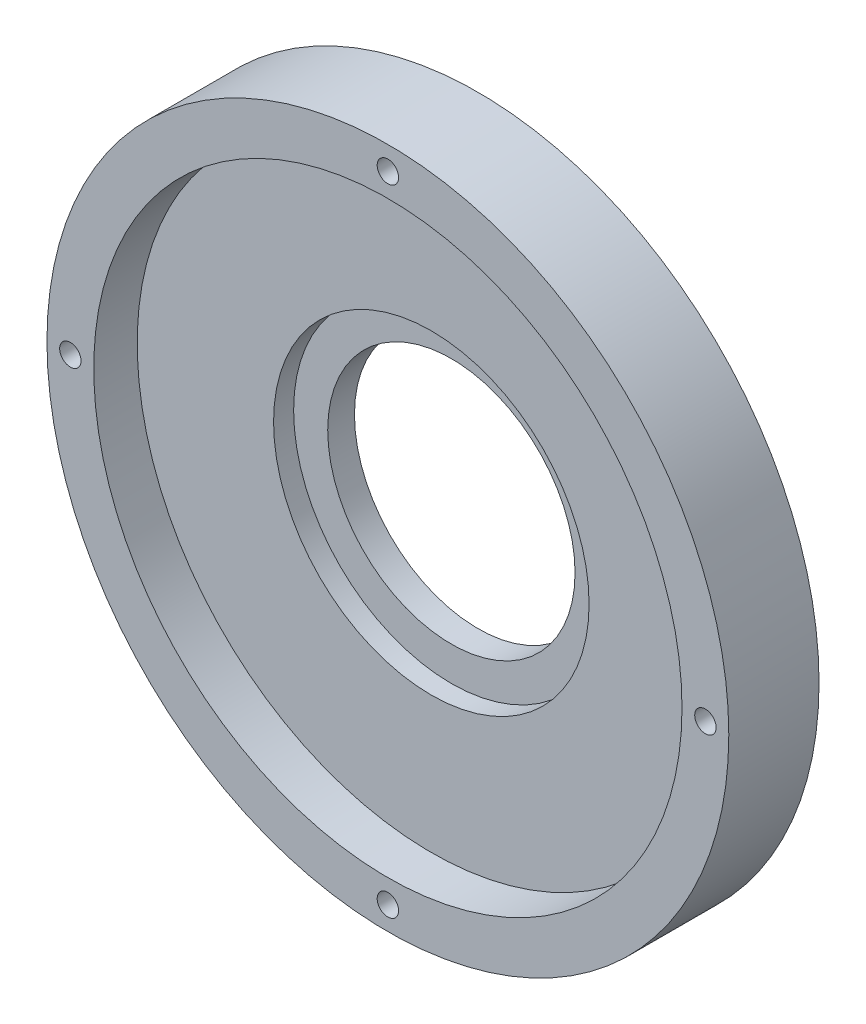
ISO-10303-21;
HEADER;
FILE_DESCRIPTION(('STEP AP214'),'2;1');
FILE_NAME('part.step','',(''),(''),'','','');
FILE_SCHEMA(('AUTOMOTIVE_DESIGN { 1 0 10303 214 1 1 1 1 }'));
ENDSEC;
DATA;
#1=APPLICATION_CONTEXT('core data for automotive mechanical design processes');
#2=APPLICATION_PROTOCOL_DEFINITION('international standard','automotive_design',2000,#1);
#3=PRODUCT_CONTEXT('',#1,'mechanical');
#4=PRODUCT('Part','Part','',(#3));
#5=PRODUCT_RELATED_PRODUCT_CATEGORY('part','',(#4));
#6=PRODUCT_DEFINITION_FORMATION('','',#4);
#7=PRODUCT_DEFINITION_CONTEXT('part definition',#1,'design');
#8=PRODUCT_DEFINITION('design','',#6,#7);
#9=PRODUCT_DEFINITION_SHAPE('','',#8);
#10=(LENGTH_UNIT() NAMED_UNIT(*) SI_UNIT(.MILLI.,.METRE.));
#11=(NAMED_UNIT(*) PLANE_ANGLE_UNIT() SI_UNIT($,.RADIAN.));
#12=(NAMED_UNIT(*) SI_UNIT($,.STERADIAN.) SOLID_ANGLE_UNIT());
#13=UNCERTAINTY_MEASURE_WITH_UNIT(LENGTH_MEASURE(1.E-05),#10,'distance_accuracy_value','');
#14=(GEOMETRIC_REPRESENTATION_CONTEXT(3) GLOBAL_UNCERTAINTY_ASSIGNED_CONTEXT((#13)) GLOBAL_UNIT_ASSIGNED_CONTEXT((#10,
#11,#12)) REPRESENTATION_CONTEXT('',''));
#15=CARTESIAN_POINT('',(0.,0.,0.));
#16=DIRECTION('',(0.,0.,1.));
#17=DIRECTION('',(1.,0.,0.));
#18=AXIS2_PLACEMENT_3D('',#15,#16,#17);
#19=CARTESIAN_POINT('',(0.,0.,59.3259018078045));
#20=DIRECTION('',(0.,0.,-1.));
#21=DIRECTION('',(-1.,0.,0.));
#22=AXIS2_PLACEMENT_3D('',#19,#20,#21);
#23=CYLINDRICAL_SURFACE('',#22,18.5);
#24=CARTESIAN_POINT('',(0.,0.,0.));
#25=DIRECTION('',(0.,0.,-1.));
#26=DIRECTION('',(-1.,0.,0.));
#27=AXIS2_PLACEMENT_3D('',#24,#25,#26);
#28=CIRCLE('',#27,18.5);
#29=CARTESIAN_POINT('',(-18.5,0.,0.));
#30=VERTEX_POINT('',#29);
#31=EDGE_CURVE('E59',#30,#30,#28,.T.);
#32=ORIENTED_EDGE('',*,*,#31,.T.);
#33=EDGE_LOOP('',(#32));
#34=FACE_BOUND('',#33,.T.);
#35=CARTESIAN_POINT('',(0.,0.,4.));
#36=DIRECTION('',(0.,0.,1.));
#37=DIRECTION('',(1.,0.,0.));
#38=AXIS2_PLACEMENT_3D('',#35,#36,#37);
#39=CIRCLE('',#38,18.5);
#40=CARTESIAN_POINT('',(18.5,0.,4.));
#41=VERTEX_POINT('',#40);
#42=EDGE_CURVE('E43',#41,#41,#39,.F.);
#43=ORIENTED_EDGE('',*,*,#42,.F.);
#44=EDGE_LOOP('',(#43));
#45=FACE_BOUND('',#44,.T.);
#46=ADVANCED_FACE('F39',(#34,#45),#23,.F.);
#47=CARTESIAN_POINT('',(0.,0.,13.5));
#48=DIRECTION('',(0.,0.,-1.));
#49=DIRECTION('',(-1.,0.,0.));
#50=AXIS2_PLACEMENT_3D('',#47,#48,#49);
#51=CYLINDRICAL_SURFACE('',#50,51.);
#52=CARTESIAN_POINT('',(0.,0.,13.5));
#53=DIRECTION('',(0.,0.,1.));
#54=DIRECTION('',(1.,0.,0.));
#55=AXIS2_PLACEMENT_3D('',#52,#53,#54);
#56=CIRCLE('',#55,51.);
#57=CARTESIAN_POINT('',(51.,0.,13.5));
#58=VERTEX_POINT('',#57);
#59=EDGE_CURVE('E11',#58,#58,#56,.T.);
#60=ORIENTED_EDGE('',*,*,#59,.F.);
#61=EDGE_LOOP('',(#60));
#62=FACE_BOUND('',#61,.T.);
#63=CARTESIAN_POINT('',(0.,0.,0.));
#64=DIRECTION('',(0.,0.,1.));
#65=DIRECTION('',(1.,0.,0.));
#66=AXIS2_PLACEMENT_3D('',#63,#64,#65);
#67=CIRCLE('',#66,51.);
#68=CARTESIAN_POINT('',(51.,0.,0.));
#69=VERTEX_POINT('',#68);
#70=EDGE_CURVE('E47',#69,#69,#67,.T.);
#71=ORIENTED_EDGE('',*,*,#70,.T.);
#72=EDGE_LOOP('',(#71));
#73=FACE_BOUND('',#72,.T.);
#74=ADVANCED_FACE('F41',(#62,#73),#51,.T.);
#75=CARTESIAN_POINT('',(0.,0.,13.5));
#76=DIRECTION('',(0.,0.,1.));
#77=DIRECTION('',(1.,0.,0.));
#78=AXIS2_PLACEMENT_3D('',#75,#76,#77);
#79=PLANE('',#78);
#80=CARTESIAN_POINT('',(0.,47.5,13.5));
#81=DIRECTION('',(0.,0.,1.));
#82=DIRECTION('',(1.,0.,0.));
#83=AXIS2_PLACEMENT_3D('',#80,#81,#82);
#84=CIRCLE('',#83,1.6);
#85=CARTESIAN_POINT('',(1.6,47.5,13.5));
#86=VERTEX_POINT('',#85);
#87=EDGE_CURVE('E86',#86,#86,#84,.T.);
#88=ORIENTED_EDGE('',*,*,#87,.F.);
#89=EDGE_LOOP('',(#88));
#90=FACE_BOUND('',#89,.T.);
#91=CARTESIAN_POINT('',(47.5,-8.2572837456496E-13,13.5));
#92=DIRECTION('',(0.,0.,1.));
#93=DIRECTION('',(1.,0.,0.));
#94=AXIS2_PLACEMENT_3D('',#91,#92,#93);
#95=CIRCLE('',#94,1.6);
#96=CARTESIAN_POINT('',(49.1,-8.2572837456496E-13,13.5));
#97=VERTEX_POINT('',#96);
#98=EDGE_CURVE('E83',#97,#97,#95,.T.);
#99=ORIENTED_EDGE('',*,*,#98,.F.);
#100=EDGE_LOOP('',(#99));
#101=FACE_BOUND('',#100,.T.);
#102=CARTESIAN_POINT('',(-9.95378632504303E-13,-47.5,13.5));
#103=DIRECTION('',(0.,0.,1.));
#104=DIRECTION('',(1.,0.,0.));
#105=AXIS2_PLACEMENT_3D('',#102,#103,#104);
#106=CIRCLE('',#105,1.6);
#107=CARTESIAN_POINT('',(1.599999999999,-47.5,13.5));
#108=VERTEX_POINT('',#107);
#109=EDGE_CURVE('E77',#108,#108,#106,.T.);
#110=ORIENTED_EDGE('',*,*,#109,.F.);
#111=EDGE_LOOP('',(#110));
#112=FACE_BOUND('',#111,.T.);
#113=CARTESIAN_POINT('',(-47.5,0.,13.5));
#114=DIRECTION('',(0.,0.,1.));
#115=DIRECTION('',(1.,0.,0.));
#116=AXIS2_PLACEMENT_3D('',#113,#114,#115);
#117=CIRCLE('',#116,1.6);
#118=CARTESIAN_POINT('',(-45.9,0.,13.5));
#119=VERTEX_POINT('',#118);
#120=EDGE_CURVE('E69',#119,#119,#117,.T.);
#121=ORIENTED_EDGE('',*,*,#120,.F.);
#122=EDGE_LOOP('',(#121));
#123=FACE_BOUND('',#122,.T.);
#124=CARTESIAN_POINT('',(0.,0.,13.5));
#125=DIRECTION('',(0.,0.,1.));
#126=DIRECTION('',(1.,0.,0.));
#127=AXIS2_PLACEMENT_3D('',#124,#125,#126);
#128=CIRCLE('',#127,44.);
#129=CARTESIAN_POINT('',(44.,0.,13.5));
#130=VERTEX_POINT('',#129);
#131=EDGE_CURVE('E52',#130,#130,#128,.T.);
#132=ORIENTED_EDGE('',*,*,#131,.F.);
#133=EDGE_LOOP('',(#132));
#134=FACE_BOUND('',#133,.T.);
#135=ORIENTED_EDGE('',*,*,#59,.T.);
#136=EDGE_LOOP('',(#135));
#137=FACE_BOUND('',#136,.T.);
#138=ADVANCED_FACE('F123',(#90,#101,#112,#123,#134,#137),#79,.T.);
#139=CARTESIAN_POINT('',(0.,0.,0.));
#140=DIRECTION('',(0.,0.,1.));
#141=DIRECTION('',(1.,0.,0.));
#142=AXIS2_PLACEMENT_3D('',#139,#140,#141);
#143=PLANE('',#142);
#144=CARTESIAN_POINT('',(33.5875721063608,-33.5875721063612,0.));
#145=DIRECTION('',(0.,0.,-1.));
#146=DIRECTION('',(-1.,0.,0.));
#147=AXIS2_PLACEMENT_3D('',#144,#145,#146);
#148=CIRCLE('',#147,2.25);
#149=CARTESIAN_POINT('',(31.3375721063608,-33.5875721063612,0.));
#150=VERTEX_POINT('',#149);
#151=EDGE_CURVE('E102',#150,#150,#148,.T.);
#152=ORIENTED_EDGE('',*,*,#151,.F.);
#153=EDGE_LOOP('',(#152));
#154=FACE_BOUND('',#153,.T.);
#155=CARTESIAN_POINT('',(-33.5875721063612,-33.5875721063608,0.));
#156=DIRECTION('',(0.,0.,-1.));
#157=DIRECTION('',(-1.,0.,0.));
#158=AXIS2_PLACEMENT_3D('',#155,#156,#157);
#159=CIRCLE('',#158,2.25);
#160=CARTESIAN_POINT('',(-35.8375721063612,-33.5875721063608,0.));
#161=VERTEX_POINT('',#160);
#162=EDGE_CURVE('E108',#161,#161,#159,.T.);
#163=ORIENTED_EDGE('',*,*,#162,.F.);
#164=EDGE_LOOP('',(#163));
#165=FACE_BOUND('',#164,.T.);
#166=CARTESIAN_POINT('',(-33.5875721063608,33.5875721063612,0.));
#167=DIRECTION('',(0.,0.,-1.));
#168=DIRECTION('',(-1.,0.,0.));
#169=AXIS2_PLACEMENT_3D('',#166,#167,#168);
#170=CIRCLE('',#169,2.25);
#171=CARTESIAN_POINT('',(-35.8375721063608,33.5875721063612,0.));
#172=VERTEX_POINT('',#171);
#173=EDGE_CURVE('E96',#172,#172,#170,.T.);
#174=ORIENTED_EDGE('',*,*,#173,.F.);
#175=EDGE_LOOP('',(#174));
#176=FACE_BOUND('',#175,.T.);
#177=CARTESIAN_POINT('',(33.5875721063612,33.5875721063608,0.));
#178=DIRECTION('',(0.,0.,-1.));
#179=DIRECTION('',(-1.,0.,0.));
#180=AXIS2_PLACEMENT_3D('',#177,#178,#179);
#181=CIRCLE('',#180,2.25);
#182=CARTESIAN_POINT('',(31.3375721063612,33.5875721063608,0.));
#183=VERTEX_POINT('',#182);
#184=EDGE_CURVE('E93',#183,#183,#181,.T.);
#185=ORIENTED_EDGE('',*,*,#184,.F.);
#186=EDGE_LOOP('',(#185));
#187=FACE_BOUND('',#186,.T.);
#188=CARTESIAN_POINT('',(0.,47.5,0.));
#189=DIRECTION('',(0.,0.,1.));
#190=DIRECTION('',(1.,0.,0.));
#191=AXIS2_PLACEMENT_3D('',#188,#189,#190);
#192=CIRCLE('',#191,1.6);
#193=CARTESIAN_POINT('',(1.6,47.5,0.));
#194=VERTEX_POINT('',#193);
#195=EDGE_CURVE('E68',#194,#194,#192,.F.);
#196=ORIENTED_EDGE('',*,*,#195,.F.);
#197=EDGE_LOOP('',(#196));
#198=FACE_BOUND('',#197,.T.);
#199=CARTESIAN_POINT('',(47.5,-8.2572837456496E-13,0.));
#200=DIRECTION('',(0.,0.,1.));
#201=DIRECTION('',(1.,0.,0.));
#202=AXIS2_PLACEMENT_3D('',#199,#200,#201);
#203=CIRCLE('',#202,1.6);
#204=CARTESIAN_POINT('',(49.1,-8.2572837456496E-13,0.));
#205=VERTEX_POINT('',#204);
#206=EDGE_CURVE('E80',#205,#205,#203,.F.);
#207=ORIENTED_EDGE('',*,*,#206,.F.);
#208=EDGE_LOOP('',(#207));
#209=FACE_BOUND('',#208,.T.);
#210=CARTESIAN_POINT('',(-9.95378632504303E-13,-47.5,0.));
#211=DIRECTION('',(0.,0.,1.));
#212=DIRECTION('',(1.,0.,0.));
#213=AXIS2_PLACEMENT_3D('',#210,#211,#212);
#214=CIRCLE('',#213,1.6);
#215=CARTESIAN_POINT('',(1.599999999999,-47.5,0.));
#216=VERTEX_POINT('',#215);
#217=EDGE_CURVE('E72',#216,#216,#214,.F.);
#218=ORIENTED_EDGE('',*,*,#217,.F.);
#219=EDGE_LOOP('',(#218));
#220=FACE_BOUND('',#219,.T.);
#221=CARTESIAN_POINT('',(-47.5,0.,0.));
#222=DIRECTION('',(0.,0.,1.));
#223=DIRECTION('',(1.,0.,0.));
#224=AXIS2_PLACEMENT_3D('',#221,#222,#223);
#225=CIRCLE('',#224,1.6);
#226=CARTESIAN_POINT('',(-45.9,0.,0.));
#227=VERTEX_POINT('',#226);
#228=EDGE_CURVE('E73',#227,#227,#225,.F.);
#229=ORIENTED_EDGE('',*,*,#228,.F.);
#230=EDGE_LOOP('',(#229));
#231=FACE_BOUND('',#230,.T.);
#232=ORIENTED_EDGE('',*,*,#31,.F.);
#233=EDGE_LOOP('',(#232));
#234=FACE_BOUND('',#233,.T.);
#235=ORIENTED_EDGE('',*,*,#70,.F.);
#236=EDGE_LOOP('',(#235));
#237=FACE_BOUND('',#236,.T.);
#238=ADVANCED_FACE('F119',(#154,#165,#176,#187,#198,#209,#220,#231,#234,#237),#143,.F.);
#239=CARTESIAN_POINT('',(0.,0.,13.5));
#240=DIRECTION('',(0.,0.,-1.));
#241=DIRECTION('',(-1.,0.,0.));
#242=AXIS2_PLACEMENT_3D('',#239,#240,#241);
#243=CYLINDRICAL_SURFACE('',#242,44.);
#244=ORIENTED_EDGE('',*,*,#131,.T.);
#245=EDGE_LOOP('',(#244));
#246=FACE_BOUND('',#245,.T.);
#247=CARTESIAN_POINT('',(0.,0.,7.));
#248=DIRECTION('',(0.,0.,1.));
#249=DIRECTION('',(1.,0.,0.));
#250=AXIS2_PLACEMENT_3D('',#247,#248,#249);
#251=CIRCLE('',#250,44.);
#252=CARTESIAN_POINT('',(44.,0.,7.));
#253=VERTEX_POINT('',#252);
#254=EDGE_CURVE('E56',#253,#253,#251,.T.);
#255=ORIENTED_EDGE('',*,*,#254,.F.);
#256=EDGE_LOOP('',(#255));
#257=FACE_BOUND('',#256,.T.);
#258=ADVANCED_FACE('F122',(#246,#257),#243,.F.);
#259=CARTESIAN_POINT('',(0.,0.,7.));
#260=DIRECTION('',(0.,0.,1.));
#261=DIRECTION('',(1.,0.,0.));
#262=AXIS2_PLACEMENT_3D('',#259,#260,#261);
#263=PLANE('',#262);
#264=CARTESIAN_POINT('',(0.,0.,7.));
#265=DIRECTION('',(0.,0.,1.));
#266=DIRECTION('',(1.,0.,0.));
#267=AXIS2_PLACEMENT_3D('',#264,#265,#266);
#268=CIRCLE('',#267,23.6);
#269=CARTESIAN_POINT('',(23.6,0.,7.));
#270=VERTEX_POINT('',#269);
#271=EDGE_CURVE('E65',#270,#270,#268,.T.);
#272=ORIENTED_EDGE('',*,*,#271,.F.);
#273=EDGE_LOOP('',(#272));
#274=FACE_BOUND('',#273,.T.);
#275=ORIENTED_EDGE('',*,*,#254,.T.);
#276=EDGE_LOOP('',(#275));
#277=FACE_BOUND('',#276,.T.);
#278=ADVANCED_FACE('F159',(#274,#277),#263,.T.);
#279=CARTESIAN_POINT('',(0.,0.,4.));
#280=DIRECTION('',(0.,0.,1.));
#281=DIRECTION('',(1.,0.,0.));
#282=AXIS2_PLACEMENT_3D('',#279,#280,#281);
#283=PLANE('',#282);
#284=CARTESIAN_POINT('',(0.,0.,4.));
#285=DIRECTION('',(0.,0.,1.));
#286=DIRECTION('',(1.,0.,0.));
#287=AXIS2_PLACEMENT_3D('',#284,#285,#286);
#288=CIRCLE('',#287,23.6);
#289=CARTESIAN_POINT('',(23.6,0.,4.));
#290=VERTEX_POINT('',#289);
#291=EDGE_CURVE('E62',#290,#290,#288,.F.);
#292=ORIENTED_EDGE('',*,*,#291,.F.);
#293=EDGE_LOOP('',(#292));
#294=FACE_BOUND('',#293,.T.);
#295=ORIENTED_EDGE('',*,*,#42,.T.);
#296=EDGE_LOOP('',(#295));
#297=FACE_BOUND('',#296,.T.);
#298=ADVANCED_FACE('F161',(#294,#297),#283,.T.);
#299=CARTESIAN_POINT('',(0.,0.,-66.7508801440101));
#300=DIRECTION('',(0.,0.,1.));
#301=DIRECTION('',(1.,0.,0.));
#302=AXIS2_PLACEMENT_3D('',#299,#300,#301);
#303=CYLINDRICAL_SURFACE('',#302,23.6);
#304=ORIENTED_EDGE('',*,*,#291,.T.);
#305=EDGE_LOOP('',(#304));
#306=FACE_BOUND('',#305,.T.);
#307=ORIENTED_EDGE('',*,*,#271,.T.);
#308=EDGE_LOOP('',(#307));
#309=FACE_BOUND('',#308,.T.);
#310=ADVANCED_FACE('F156',(#306,#309),#303,.F.);
#311=CARTESIAN_POINT('',(-47.5,0.,-4.5254833995939));
#312=DIRECTION('',(0.,0.,1.));
#313=DIRECTION('',(1.,0.,0.));
#314=AXIS2_PLACEMENT_3D('',#311,#312,#313);
#315=CYLINDRICAL_SURFACE('',#314,1.6);
#316=ORIENTED_EDGE('',*,*,#228,.T.);
#317=EDGE_LOOP('',(#316));
#318=FACE_BOUND('',#317,.T.);
#319=ORIENTED_EDGE('',*,*,#120,.T.);
#320=EDGE_LOOP('',(#319));
#321=FACE_BOUND('',#320,.T.);
#322=ADVANCED_FACE('F173',(#318,#321),#315,.F.);
#323=CARTESIAN_POINT('',(-9.95378632504303E-13,-47.5,-4.5254833995939));
#324=DIRECTION('',(0.,0.,1.));
#325=DIRECTION('',(1.,0.,0.));
#326=AXIS2_PLACEMENT_3D('',#323,#324,#325);
#327=CYLINDRICAL_SURFACE('',#326,1.6);
#328=ORIENTED_EDGE('',*,*,#217,.T.);
#329=EDGE_LOOP('',(#328));
#330=FACE_BOUND('',#329,.T.);
#331=ORIENTED_EDGE('',*,*,#109,.T.);
#332=EDGE_LOOP('',(#331));
#333=FACE_BOUND('',#332,.T.);
#334=ADVANCED_FACE('F178',(#330,#333),#327,.F.);
#335=CARTESIAN_POINT('',(47.5,-8.2572837456496E-13,-4.5254833995939));
#336=DIRECTION('',(0.,0.,1.));
#337=DIRECTION('',(1.,0.,0.));
#338=AXIS2_PLACEMENT_3D('',#335,#336,#337);
#339=CYLINDRICAL_SURFACE('',#338,1.6);
#340=ORIENTED_EDGE('',*,*,#206,.T.);
#341=EDGE_LOOP('',(#340));
#342=FACE_BOUND('',#341,.T.);
#343=ORIENTED_EDGE('',*,*,#98,.T.);
#344=EDGE_LOOP('',(#343));
#345=FACE_BOUND('',#344,.T.);
#346=ADVANCED_FACE('F188',(#342,#345),#339,.F.);
#347=CARTESIAN_POINT('',(0.,47.5,-4.5254833995939));
#348=DIRECTION('',(0.,0.,1.));
#349=DIRECTION('',(1.,0.,0.));
#350=AXIS2_PLACEMENT_3D('',#347,#348,#349);
#351=CYLINDRICAL_SURFACE('',#350,1.6);
#352=ORIENTED_EDGE('',*,*,#195,.T.);
#353=EDGE_LOOP('',(#352));
#354=FACE_BOUND('',#353,.T.);
#355=ORIENTED_EDGE('',*,*,#87,.T.);
#356=EDGE_LOOP('',(#355));
#357=FACE_BOUND('',#356,.T.);
#358=ADVANCED_FACE('F195',(#354,#357),#351,.F.);
#359=CARTESIAN_POINT('',(33.5875721063612,33.5875721063608,6.));
#360=DIRECTION('',(0.,0.,-1.));
#361=DIRECTION('',(-1.,0.,0.));
#362=AXIS2_PLACEMENT_3D('',#359,#360,#361);
#363=CYLINDRICAL_SURFACE('',#362,2.25);
#364=CARTESIAN_POINT('',(33.5875721063612,33.5875721063608,6.));
#365=DIRECTION('',(0.,0.,-1.));
#366=DIRECTION('',(-1.,0.,0.));
#367=AXIS2_PLACEMENT_3D('',#364,#365,#366);
#368=CIRCLE('',#367,2.25);
#369=CARTESIAN_POINT('',(31.3375721063612,33.5875721063608,6.));
#370=VERTEX_POINT('',#369);
#371=EDGE_CURVE('E76',#370,#370,#368,.T.);
#372=ORIENTED_EDGE('',*,*,#371,.F.);
#373=EDGE_LOOP('',(#372));
#374=FACE_BOUND('',#373,.T.);
#375=ORIENTED_EDGE('',*,*,#184,.T.);
#376=EDGE_LOOP('',(#375));
#377=FACE_BOUND('',#376,.T.);
#378=ADVANCED_FACE('F199',(#374,#377),#363,.F.);
#379=CARTESIAN_POINT('',(33.5875721063612,33.5875721063608,6.));
#380=DIRECTION('',(0.,0.,-1.));
#381=DIRECTION('',(-1.,0.,0.));
#382=AXIS2_PLACEMENT_3D('',#379,#380,#381);
#383=PLANE('',#382);
#384=ORIENTED_EDGE('',*,*,#371,.T.);
#385=EDGE_LOOP('',(#384));
#386=FACE_BOUND('',#385,.T.);
#387=ADVANCED_FACE('F203',(#386),#383,.T.);
#388=CARTESIAN_POINT('',(-33.5875721063608,33.5875721063612,6.));
#389=DIRECTION('',(0.,0.,-1.));
#390=DIRECTION('',(-1.,0.,0.));
#391=AXIS2_PLACEMENT_3D('',#388,#389,#390);
#392=CYLINDRICAL_SURFACE('',#391,2.25);
#393=CARTESIAN_POINT('',(-33.5875721063608,33.5875721063612,6.));
#394=DIRECTION('',(0.,0.,-1.));
#395=DIRECTION('',(-1.,0.,0.));
#396=AXIS2_PLACEMENT_3D('',#393,#394,#395);
#397=CIRCLE('',#396,2.25);
#398=CARTESIAN_POINT('',(-35.8375721063608,33.5875721063612,6.));
#399=VERTEX_POINT('',#398);
#400=EDGE_CURVE('E111',#399,#399,#397,.T.);
#401=ORIENTED_EDGE('',*,*,#400,.F.);
#402=EDGE_LOOP('',(#401));
#403=FACE_BOUND('',#402,.T.);
#404=ORIENTED_EDGE('',*,*,#173,.T.);
#405=EDGE_LOOP('',(#404));
#406=FACE_BOUND('',#405,.T.);
#407=ADVANCED_FACE('F117',(#403,#406),#392,.F.);
#408=CARTESIAN_POINT('',(-33.5875721063608,33.5875721063612,6.));
#409=DIRECTION('',(0.,0.,-1.));
#410=DIRECTION('',(-1.,0.,0.));
#411=AXIS2_PLACEMENT_3D('',#408,#409,#410);
#412=PLANE('',#411);
#413=ORIENTED_EDGE('',*,*,#400,.T.);
#414=EDGE_LOOP('',(#413));
#415=FACE_BOUND('',#414,.T.);
#416=ADVANCED_FACE('F223',(#415),#412,.T.);
#417=CARTESIAN_POINT('',(-33.5875721063612,-33.5875721063608,6.));
#418=DIRECTION('',(0.,0.,-1.));
#419=DIRECTION('',(-1.,0.,0.));
#420=AXIS2_PLACEMENT_3D('',#417,#418,#419);
#421=CYLINDRICAL_SURFACE('',#420,2.25);
#422=CARTESIAN_POINT('',(-33.5875721063612,-33.5875721063608,6.));
#423=DIRECTION('',(0.,0.,-1.));
#424=DIRECTION('',(-1.,0.,0.));
#425=AXIS2_PLACEMENT_3D('',#422,#423,#424);
#426=CIRCLE('',#425,2.25);
#427=CARTESIAN_POINT('',(-35.8375721063612,-33.5875721063608,6.));
#428=VERTEX_POINT('',#427);
#429=EDGE_CURVE('E105',#428,#428,#426,.T.);
#430=ORIENTED_EDGE('',*,*,#429,.F.);
#431=EDGE_LOOP('',(#430));
#432=FACE_BOUND('',#431,.T.);
#433=ORIENTED_EDGE('',*,*,#162,.T.);
#434=EDGE_LOOP('',(#433));
#435=FACE_BOUND('',#434,.T.);
#436=ADVANCED_FACE('F219',(#432,#435),#421,.F.);
#437=CARTESIAN_POINT('',(-33.5875721063612,-33.5875721063608,6.));
#438=DIRECTION('',(0.,0.,-1.));
#439=DIRECTION('',(-1.,0.,0.));
#440=AXIS2_PLACEMENT_3D('',#437,#438,#439);
#441=PLANE('',#440);
#442=ORIENTED_EDGE('',*,*,#429,.T.);
#443=EDGE_LOOP('',(#442));
#444=FACE_BOUND('',#443,.T.);
#445=ADVANCED_FACE('F215',(#444),#441,.T.);
#446=CARTESIAN_POINT('',(33.5875721063608,-33.5875721063612,6.));
#447=DIRECTION('',(0.,0.,-1.));
#448=DIRECTION('',(-1.,0.,0.));
#449=AXIS2_PLACEMENT_3D('',#446,#447,#448);
#450=CYLINDRICAL_SURFACE('',#449,2.25);
#451=CARTESIAN_POINT('',(33.5875721063608,-33.5875721063612,6.));
#452=DIRECTION('',(0.,0.,-1.));
#453=DIRECTION('',(-1.,0.,0.));
#454=AXIS2_PLACEMENT_3D('',#451,#452,#453);
#455=CIRCLE('',#454,2.25);
#456=CARTESIAN_POINT('',(31.3375721063608,-33.5875721063612,6.));
#457=VERTEX_POINT('',#456);
#458=EDGE_CURVE('E99',#457,#457,#455,.T.);
#459=ORIENTED_EDGE('',*,*,#458,.F.);
#460=EDGE_LOOP('',(#459));
#461=FACE_BOUND('',#460,.T.);
#462=ORIENTED_EDGE('',*,*,#151,.T.);
#463=EDGE_LOOP('',(#462));
#464=FACE_BOUND('',#463,.T.);
#465=ADVANCED_FACE('F211',(#461,#464),#450,.F.);
#466=CARTESIAN_POINT('',(33.5875721063608,-33.5875721063612,6.));
#467=DIRECTION('',(0.,0.,-1.));
#468=DIRECTION('',(-1.,0.,0.));
#469=AXIS2_PLACEMENT_3D('',#466,#467,#468);
#470=PLANE('',#469);
#471=ORIENTED_EDGE('',*,*,#458,.T.);
#472=EDGE_LOOP('',(#471));
#473=FACE_BOUND('',#472,.T.);
#474=ADVANCED_FACE('F208',(#473),#470,.T.);
#475=CLOSED_SHELL('',(#46,#74,#138,#238,#258,#278,#298,#310,#322,#334,#346,#358,#378,#387,#407,
#416,#436,#445,#465,#474));
#476=MANIFOLD_SOLID_BREP('B2',#475);
#477=ADVANCED_BREP_SHAPE_REPRESENTATION('',(#18,#476),#14);
#478=SHAPE_DEFINITION_REPRESENTATION(#9,#477);
ENDSEC;
END-ISO-10303-21;
